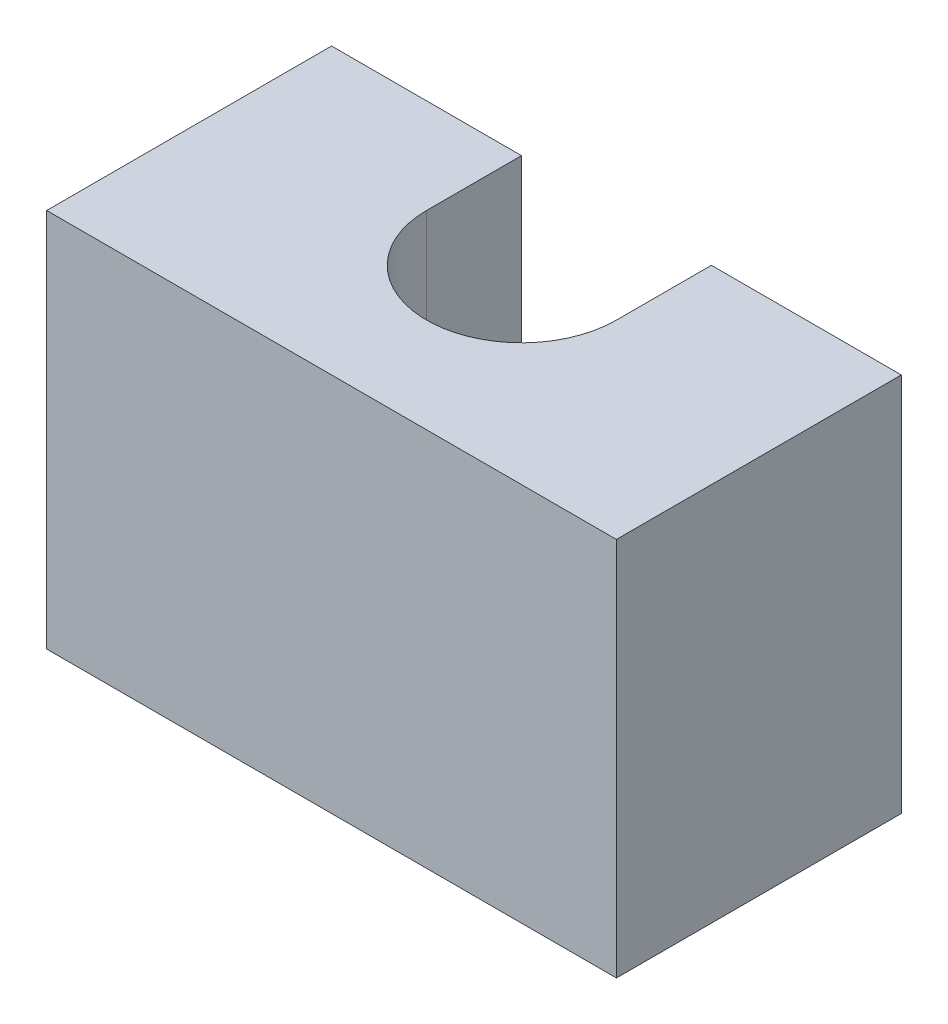
ISO-10303-21;
HEADER;
FILE_DESCRIPTION(('STEP AP214'),'2;1');
FILE_NAME('part.step','',(''),(''),'','','');
FILE_SCHEMA(('AUTOMOTIVE_DESIGN { 1 0 10303 214 1 1 1 1 }'));
ENDSEC;
DATA;
#1=APPLICATION_CONTEXT('core data for automotive mechanical design processes');
#2=APPLICATION_PROTOCOL_DEFINITION('international standard','automotive_design',2000,#1);
#3=PRODUCT_CONTEXT('',#1,'mechanical');
#4=PRODUCT('Part','Part','',(#3));
#5=PRODUCT_RELATED_PRODUCT_CATEGORY('part','',(#4));
#6=PRODUCT_DEFINITION_FORMATION('','',#4);
#7=PRODUCT_DEFINITION_CONTEXT('part definition',#1,'design');
#8=PRODUCT_DEFINITION('design','',#6,#7);
#9=PRODUCT_DEFINITION_SHAPE('','',#8);
#10=(LENGTH_UNIT() NAMED_UNIT(*) SI_UNIT(.MILLI.,.METRE.));
#11=(NAMED_UNIT(*) PLANE_ANGLE_UNIT() SI_UNIT($,.RADIAN.));
#12=(NAMED_UNIT(*) SI_UNIT($,.STERADIAN.) SOLID_ANGLE_UNIT());
#13=UNCERTAINTY_MEASURE_WITH_UNIT(LENGTH_MEASURE(1.E-05),#10,'distance_accuracy_value','');
#14=(GEOMETRIC_REPRESENTATION_CONTEXT(3) GLOBAL_UNCERTAINTY_ASSIGNED_CONTEXT((#13)) GLOBAL_UNIT_ASSIGNED_CONTEXT((#10,
#11,#12)) REPRESENTATION_CONTEXT('',''));
#15=CARTESIAN_POINT('',(0.,0.,0.));
#16=DIRECTION('',(0.,0.,1.));
#17=DIRECTION('',(1.,0.,0.));
#18=AXIS2_PLACEMENT_3D('',#15,#16,#17);
#19=CARTESIAN_POINT('',(-15.,20.,0.));
#20=DIRECTION('',(0.,0.,1.));
#21=DIRECTION('',(1.,0.,0.));
#22=AXIS2_PLACEMENT_3D('',#19,#20,#21);
#23=PLANE('',#22);
#24=DIRECTION('',(-1.,0.,0.));
#25=VECTOR('',#24,1.);
#26=CARTESIAN_POINT('',(-15.,0.,0.));
#27=LINE('',#26,#25);
#28=CARTESIAN_POINT('',(-5.,0.,0.));
#29=VERTEX_POINT('',#28);
#30=CARTESIAN_POINT('',(-15.,0.,0.));
#31=VERTEX_POINT('',#30);
#32=EDGE_CURVE('E133',#29,#31,#27,.T.);
#33=ORIENTED_EDGE('',*,*,#32,.T.);
#34=DIRECTION('',(0.,-1.,0.));
#35=VECTOR('',#34,1.);
#36=CARTESIAN_POINT('',(-15.,20.,0.));
#37=LINE('',#36,#35);
#38=CARTESIAN_POINT('',(-15.,20.,0.));
#39=VERTEX_POINT('',#38);
#40=EDGE_CURVE('E11',#39,#31,#37,.T.);
#41=ORIENTED_EDGE('',*,*,#40,.F.);
#42=DIRECTION('',(-1.,0.,0.));
#43=VECTOR('',#42,1.);
#44=CARTESIAN_POINT('',(-15.,20.,0.));
#45=LINE('',#44,#43);
#46=CARTESIAN_POINT('',(-5.,20.,0.));
#47=VERTEX_POINT('',#46);
#48=EDGE_CURVE('E147',#47,#39,#45,.T.);
#49=ORIENTED_EDGE('',*,*,#48,.F.);
#50=DIRECTION('',(0.,-1.,0.));
#51=VECTOR('',#50,1.);
#52=CARTESIAN_POINT('',(-5.,20.,0.));
#53=LINE('',#52,#51);
#54=EDGE_CURVE('E129',#47,#29,#53,.T.);
#55=ORIENTED_EDGE('',*,*,#54,.T.);
#56=EDGE_LOOP('',(#33,#41,#49,#55));
#57=FACE_BOUND('',#56,.T.);
#58=ADVANCED_FACE('F37',(#57),#23,.F.);
#59=CARTESIAN_POINT('',(-15.,20.,15.));
#60=DIRECTION('',(1.,0.,0.));
#61=DIRECTION('',(0.,0.,-1.));
#62=AXIS2_PLACEMENT_3D('',#59,#60,#61);
#63=PLANE('',#62);
#64=DIRECTION('',(0.,0.,1.));
#65=VECTOR('',#64,1.);
#66=CARTESIAN_POINT('',(-15.,0.,15.));
#67=LINE('',#66,#65);
#68=CARTESIAN_POINT('',(-15.,0.,15.));
#69=VERTEX_POINT('',#68);
#70=EDGE_CURVE('E136',#31,#69,#67,.T.);
#71=ORIENTED_EDGE('',*,*,#70,.T.);
#72=DIRECTION('',(0.,-1.,0.));
#73=VECTOR('',#72,1.);
#74=CARTESIAN_POINT('',(-15.,20.,15.));
#75=LINE('',#74,#73);
#76=CARTESIAN_POINT('',(-15.,20.,15.));
#77=VERTEX_POINT('',#76);
#78=EDGE_CURVE('E45',#77,#69,#75,.T.);
#79=ORIENTED_EDGE('',*,*,#78,.F.);
#80=DIRECTION('',(0.,0.,1.));
#81=VECTOR('',#80,1.);
#82=CARTESIAN_POINT('',(-15.,20.,15.));
#83=LINE('',#82,#81);
#84=EDGE_CURVE('E96',#39,#77,#83,.T.);
#85=ORIENTED_EDGE('',*,*,#84,.F.);
#86=ORIENTED_EDGE('',*,*,#40,.T.);
#87=EDGE_LOOP('',(#71,#79,#85,#86));
#88=FACE_BOUND('',#87,.T.);
#89=ADVANCED_FACE('F182',(#88),#63,.F.);
#90=CARTESIAN_POINT('',(15.,20.,15.));
#91=DIRECTION('',(0.,0.,-1.));
#92=DIRECTION('',(-1.,0.,0.));
#93=AXIS2_PLACEMENT_3D('',#90,#91,#92);
#94=PLANE('',#93);
#95=DIRECTION('',(1.,0.,0.));
#96=VECTOR('',#95,1.);
#97=CARTESIAN_POINT('',(15.,0.,15.));
#98=LINE('',#97,#96);
#99=CARTESIAN_POINT('',(15.,0.,15.));
#100=VERTEX_POINT('',#99);
#101=EDGE_CURVE('E138',#69,#100,#98,.T.);
#102=ORIENTED_EDGE('',*,*,#101,.T.);
#103=DIRECTION('',(0.,-1.,0.));
#104=VECTOR('',#103,1.);
#105=CARTESIAN_POINT('',(15.,20.,15.));
#106=LINE('',#105,#104);
#107=CARTESIAN_POINT('',(15.,20.,15.));
#108=VERTEX_POINT('',#107);
#109=EDGE_CURVE('E154',#108,#100,#106,.T.);
#110=ORIENTED_EDGE('',*,*,#109,.F.);
#111=DIRECTION('',(1.,0.,0.));
#112=VECTOR('',#111,1.);
#113=CARTESIAN_POINT('',(15.,20.,15.));
#114=LINE('',#113,#112);
#115=EDGE_CURVE('E162',#77,#108,#114,.T.);
#116=ORIENTED_EDGE('',*,*,#115,.F.);
#117=ORIENTED_EDGE('',*,*,#78,.T.);
#118=EDGE_LOOP('',(#102,#110,#116,#117));
#119=FACE_BOUND('',#118,.T.);
#120=ADVANCED_FACE('F160',(#119),#94,.F.);
#121=CARTESIAN_POINT('',(15.,20.,15.));
#122=DIRECTION('',(-1.,0.,0.));
#123=DIRECTION('',(0.,0.,1.));
#124=AXIS2_PLACEMENT_3D('',#121,#122,#123);
#125=PLANE('',#124);
#126=DIRECTION('',(0.,0.,-1.));
#127=VECTOR('',#126,1.);
#128=CARTESIAN_POINT('',(15.,0.,15.));
#129=LINE('',#128,#127);
#130=CARTESIAN_POINT('',(15.,0.,0.));
#131=VERTEX_POINT('',#130);
#132=EDGE_CURVE('E140',#100,#131,#129,.T.);
#133=ORIENTED_EDGE('',*,*,#132,.T.);
#134=DIRECTION('',(0.,-1.,0.));
#135=VECTOR('',#134,1.);
#136=CARTESIAN_POINT('',(15.,20.,0.));
#137=LINE('',#136,#135);
#138=CARTESIAN_POINT('',(15.,20.,0.));
#139=VERTEX_POINT('',#138);
#140=EDGE_CURVE('E151',#139,#131,#137,.T.);
#141=ORIENTED_EDGE('',*,*,#140,.F.);
#142=DIRECTION('',(0.,0.,-1.));
#143=VECTOR('',#142,1.);
#144=CARTESIAN_POINT('',(15.,20.,15.));
#145=LINE('',#144,#143);
#146=EDGE_CURVE('E174',#108,#139,#145,.T.);
#147=ORIENTED_EDGE('',*,*,#146,.F.);
#148=ORIENTED_EDGE('',*,*,#109,.T.);
#149=EDGE_LOOP('',(#133,#141,#147,#148));
#150=FACE_BOUND('',#149,.T.);
#151=ADVANCED_FACE('F170',(#150),#125,.F.);
#152=CARTESIAN_POINT('',(15.,20.,0.));
#153=DIRECTION('',(0.,0.,1.));
#154=DIRECTION('',(1.,0.,0.));
#155=AXIS2_PLACEMENT_3D('',#152,#153,#154);
#156=PLANE('',#155);
#157=DIRECTION('',(-1.,0.,0.));
#158=VECTOR('',#157,1.);
#159=CARTESIAN_POINT('',(15.,0.,0.));
#160=LINE('',#159,#158);
#161=CARTESIAN_POINT('',(5.,0.,0.));
#162=VERTEX_POINT('',#161);
#163=EDGE_CURVE('E142',#131,#162,#160,.T.);
#164=ORIENTED_EDGE('',*,*,#163,.T.);
#165=DIRECTION('',(0.,-1.,0.));
#166=VECTOR('',#165,1.);
#167=CARTESIAN_POINT('',(5.,20.,0.));
#168=LINE('',#167,#166);
#169=CARTESIAN_POINT('',(5.,20.,0.));
#170=VERTEX_POINT('',#169);
#171=EDGE_CURVE('E124',#170,#162,#168,.T.);
#172=ORIENTED_EDGE('',*,*,#171,.F.);
#173=DIRECTION('',(-1.,0.,0.));
#174=VECTOR('',#173,1.);
#175=CARTESIAN_POINT('',(15.,20.,0.));
#176=LINE('',#175,#174);
#177=EDGE_CURVE('E115',#139,#170,#176,.T.);
#178=ORIENTED_EDGE('',*,*,#177,.F.);
#179=ORIENTED_EDGE('',*,*,#140,.T.);
#180=EDGE_LOOP('',(#164,#172,#178,#179));
#181=FACE_BOUND('',#180,.T.);
#182=ADVANCED_FACE('F173',(#181),#156,.F.);
#183=CARTESIAN_POINT('',(5.,20.,0.));
#184=DIRECTION('',(1.,0.,0.));
#185=DIRECTION('',(0.,0.,-1.));
#186=AXIS2_PLACEMENT_3D('',#183,#184,#185);
#187=PLANE('',#186);
#188=DIRECTION('',(0.,0.,1.));
#189=VECTOR('',#188,1.);
#190=CARTESIAN_POINT('',(5.,0.,0.));
#191=LINE('',#190,#189);
#192=CARTESIAN_POINT('',(5.,0.,5.));
#193=VERTEX_POINT('',#192);
#194=EDGE_CURVE('E123',#162,#193,#191,.T.);
#195=ORIENTED_EDGE('',*,*,#194,.T.);
#196=DIRECTION('',(0.,-1.,0.));
#197=VECTOR('',#196,1.);
#198=CARTESIAN_POINT('',(5.,20.,5.));
#199=LINE('',#198,#197);
#200=CARTESIAN_POINT('',(5.,20.,5.));
#201=VERTEX_POINT('',#200);
#202=EDGE_CURVE('E120',#201,#193,#199,.T.);
#203=ORIENTED_EDGE('',*,*,#202,.F.);
#204=DIRECTION('',(0.,0.,1.));
#205=VECTOR('',#204,1.);
#206=CARTESIAN_POINT('',(5.,20.,0.));
#207=LINE('',#206,#205);
#208=EDGE_CURVE('E109',#170,#201,#207,.T.);
#209=ORIENTED_EDGE('',*,*,#208,.F.);
#210=ORIENTED_EDGE('',*,*,#171,.T.);
#211=EDGE_LOOP('',(#195,#203,#209,#210));
#212=FACE_BOUND('',#211,.T.);
#213=ADVANCED_FACE('F121',(#212),#187,.F.);
#214=CARTESIAN_POINT('',(0.,20.,5.));
#215=DIRECTION('',(0.,-1.,0.));
#216=DIRECTION('',(0.,0.,-1.));
#217=AXIS2_PLACEMENT_3D('',#214,#215,#216);
#218=CYLINDRICAL_SURFACE('',#217,5.);
#219=CARTESIAN_POINT('',(0.,0.,5.));
#220=DIRECTION('',(0.,-1.,0.));
#221=DIRECTION('',(0.,0.,1.));
#222=AXIS2_PLACEMENT_3D('',#219,#220,#221);
#223=CIRCLE('',#222,5.);
#224=CARTESIAN_POINT('',(-5.,0.,5.));
#225=VERTEX_POINT('',#224);
#226=EDGE_CURVE('E82',#193,#225,#223,.T.);
#227=ORIENTED_EDGE('',*,*,#226,.T.);
#228=DIRECTION('',(0.,-1.,0.));
#229=VECTOR('',#228,1.);
#230=CARTESIAN_POINT('',(-5.,20.,5.));
#231=LINE('',#230,#229);
#232=CARTESIAN_POINT('',(-5.,20.,5.));
#233=VERTEX_POINT('',#232);
#234=EDGE_CURVE('E125',#233,#225,#231,.T.);
#235=ORIENTED_EDGE('',*,*,#234,.F.);
#236=CARTESIAN_POINT('',(0.,20.,5.));
#237=DIRECTION('',(0.,-1.,0.));
#238=DIRECTION('',(0.,0.,1.));
#239=AXIS2_PLACEMENT_3D('',#236,#237,#238);
#240=CIRCLE('',#239,5.);
#241=EDGE_CURVE('E113',#201,#233,#240,.T.);
#242=ORIENTED_EDGE('',*,*,#241,.F.);
#243=ORIENTED_EDGE('',*,*,#202,.T.);
#244=EDGE_LOOP('',(#227,#235,#242,#243));
#245=FACE_BOUND('',#244,.T.);
#246=ADVANCED_FACE('F127',(#245),#218,.F.);
#247=CARTESIAN_POINT('',(-5.,20.,0.));
#248=DIRECTION('',(-1.,0.,0.));
#249=DIRECTION('',(0.,0.,1.));
#250=AXIS2_PLACEMENT_3D('',#247,#248,#249);
#251=PLANE('',#250);
#252=DIRECTION('',(0.,0.,-1.));
#253=VECTOR('',#252,1.);
#254=CARTESIAN_POINT('',(-5.,0.,0.));
#255=LINE('',#254,#253);
#256=EDGE_CURVE('E88',#225,#29,#255,.T.);
#257=ORIENTED_EDGE('',*,*,#256,.T.);
#258=ORIENTED_EDGE('',*,*,#54,.F.);
#259=DIRECTION('',(0.,0.,-1.));
#260=VECTOR('',#259,1.);
#261=CARTESIAN_POINT('',(-5.,20.,0.));
#262=LINE('',#261,#260);
#263=EDGE_CURVE('E53',#233,#47,#262,.T.);
#264=ORIENTED_EDGE('',*,*,#263,.F.);
#265=ORIENTED_EDGE('',*,*,#234,.T.);
#266=EDGE_LOOP('',(#257,#258,#264,#265));
#267=FACE_BOUND('',#266,.T.);
#268=ADVANCED_FACE('F198',(#267),#251,.F.);
#269=CARTESIAN_POINT('',(0.,20.,5.));
#270=DIRECTION('',(0.,1.,0.));
#271=DIRECTION('',(0.,0.,1.));
#272=AXIS2_PLACEMENT_3D('',#269,#270,#271);
#273=PLANE('',#272);
#274=ORIENTED_EDGE('',*,*,#48,.T.);
#275=ORIENTED_EDGE('',*,*,#84,.T.);
#276=ORIENTED_EDGE('',*,*,#115,.T.);
#277=ORIENTED_EDGE('',*,*,#146,.T.);
#278=ORIENTED_EDGE('',*,*,#177,.T.);
#279=ORIENTED_EDGE('',*,*,#208,.T.);
#280=ORIENTED_EDGE('',*,*,#241,.T.);
#281=ORIENTED_EDGE('',*,*,#263,.T.);
#282=EDGE_LOOP('',(#274,#275,#276,#277,#278,#279,#280,#281));
#283=FACE_BOUND('',#282,.T.);
#284=ADVANCED_FACE('F111',(#283),#273,.T.);
#285=CARTESIAN_POINT('',(0.,0.,5.));
#286=DIRECTION('',(0.,1.,0.));
#287=DIRECTION('',(0.,0.,1.));
#288=AXIS2_PLACEMENT_3D('',#285,#286,#287);
#289=PLANE('',#288);
#290=ORIENTED_EDGE('',*,*,#32,.F.);
#291=ORIENTED_EDGE('',*,*,#256,.F.);
#292=ORIENTED_EDGE('',*,*,#226,.F.);
#293=ORIENTED_EDGE('',*,*,#194,.F.);
#294=ORIENTED_EDGE('',*,*,#163,.F.);
#295=ORIENTED_EDGE('',*,*,#132,.F.);
#296=ORIENTED_EDGE('',*,*,#101,.F.);
#297=ORIENTED_EDGE('',*,*,#70,.F.);
#298=EDGE_LOOP('',(#290,#291,#292,#293,#294,#295,#296,#297));
#299=FACE_BOUND('',#298,.T.);
#300=ADVANCED_FACE('F166',(#299),#289,.F.);
#301=CLOSED_SHELL('',(#58,#89,#120,#151,#182,#213,#246,#268,#284,#300));
#302=MANIFOLD_SOLID_BREP('B2',#301);
#303=ADVANCED_BREP_SHAPE_REPRESENTATION('',(#18,#302),#14);
#304=SHAPE_DEFINITION_REPRESENTATION(#9,#303);
ENDSEC;
END-ISO-10303-21;
